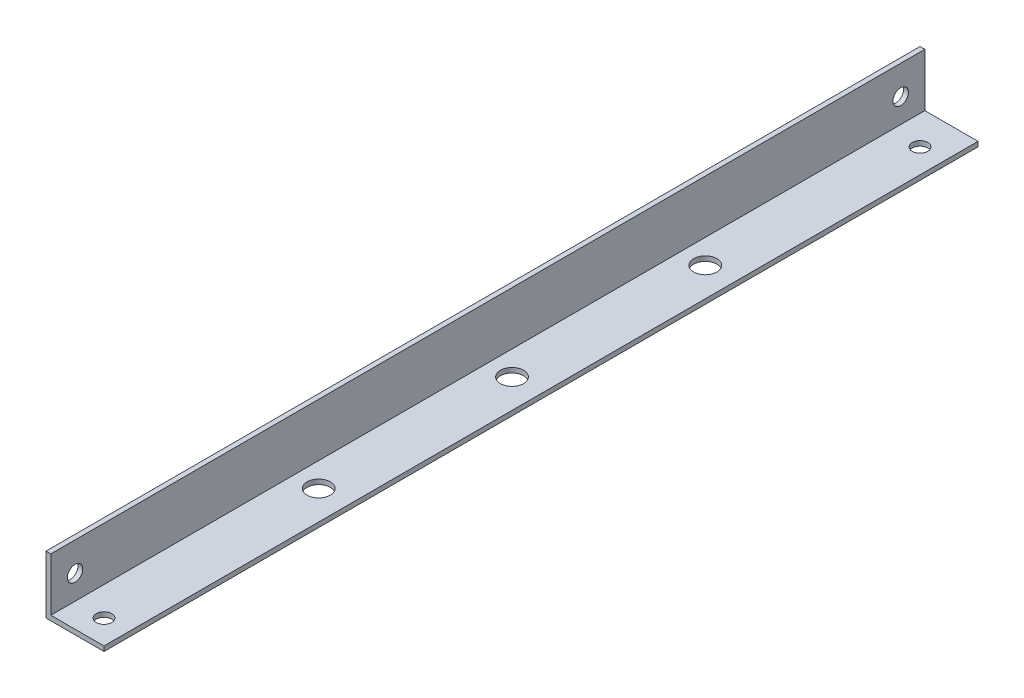
ISO-10303-21;
HEADER;
FILE_DESCRIPTION(('STEP AP214'),'2;1');
FILE_NAME('part.step','',(''),(''),'','','');
FILE_SCHEMA(('AUTOMOTIVE_DESIGN { 1 0 10303 214 1 1 1 1 }'));
ENDSEC;
DATA;
#1=APPLICATION_CONTEXT('core data for automotive mechanical design processes');
#2=APPLICATION_PROTOCOL_DEFINITION('international standard','automotive_design',2000,#1);
#3=PRODUCT_CONTEXT('',#1,'mechanical');
#4=PRODUCT('Part','Part','',(#3));
#5=PRODUCT_RELATED_PRODUCT_CATEGORY('part','',(#4));
#6=PRODUCT_DEFINITION_FORMATION('','',#4);
#7=PRODUCT_DEFINITION_CONTEXT('part definition',#1,'design');
#8=PRODUCT_DEFINITION('design','',#6,#7);
#9=PRODUCT_DEFINITION_SHAPE('','',#8);
#10=(LENGTH_UNIT() NAMED_UNIT(*) SI_UNIT(.MILLI.,.METRE.));
#11=(NAMED_UNIT(*) PLANE_ANGLE_UNIT() SI_UNIT($,.RADIAN.));
#12=(NAMED_UNIT(*) SI_UNIT($,.STERADIAN.) SOLID_ANGLE_UNIT());
#13=UNCERTAINTY_MEASURE_WITH_UNIT(LENGTH_MEASURE(1.E-05),#10,'distance_accuracy_value','');
#14=(GEOMETRIC_REPRESENTATION_CONTEXT(3) GLOBAL_UNCERTAINTY_ASSIGNED_CONTEXT((#13)) GLOBAL_UNIT_ASSIGNED_CONTEXT((#10,
#11,#12)) REPRESENTATION_CONTEXT('',''));
#15=CARTESIAN_POINT('',(0.,0.,0.));
#16=DIRECTION('',(0.,0.,1.));
#17=DIRECTION('',(1.,0.,0.));
#18=AXIS2_PLACEMENT_3D('',#15,#16,#17);
#19=CARTESIAN_POINT('',(30.,0.,226.1));
#20=DIRECTION('',(0.,1.,0.));
#21=DIRECTION('',(-1.,0.,0.));
#22=AXIS2_PLACEMENT_3D('',#19,#20,#21);
#23=PLANE('',#22);
#24=CARTESIAN_POINT('',(15.,0.,0.));
#25=DIRECTION('',(0.,1.,0.));
#26=DIRECTION('',(-1.,0.,0.));
#27=AXIS2_PLACEMENT_3D('',#24,#25,#26);
#28=CIRCLE('',#27,6.);
#29=CARTESIAN_POINT('',(9.,0.,0.));
#30=VERTEX_POINT('',#29);
#31=EDGE_CURVE('E165',#30,#30,#28,.T.);
#32=ORIENTED_EDGE('',*,*,#31,.T.);
#33=EDGE_LOOP('',(#32));
#34=FACE_BOUND('',#33,.T.);
#35=CARTESIAN_POINT('',(15.,0.,-100.));
#36=DIRECTION('',(0.,1.,0.));
#37=DIRECTION('',(1.,0.,0.));
#38=AXIS2_PLACEMENT_3D('',#35,#36,#37);
#39=CIRCLE('',#38,6.00000000000001);
#40=CARTESIAN_POINT('',(9.00000000000001,0.,-100.));
#41=VERTEX_POINT('',#40);
#42=EDGE_CURVE('E159',#41,#41,#39,.T.);
#43=ORIENTED_EDGE('',*,*,#42,.T.);
#44=EDGE_LOOP('',(#43));
#45=FACE_BOUND('',#44,.T.);
#46=CARTESIAN_POINT('',(15.,0.,100.));
#47=DIRECTION('',(0.,1.,0.));
#48=DIRECTION('',(-1.,0.,0.));
#49=AXIS2_PLACEMENT_3D('',#46,#47,#48);
#50=CIRCLE('',#49,6.00000000000001);
#51=CARTESIAN_POINT('',(9.00000000000001,0.,100.));
#52=VERTEX_POINT('',#51);
#53=EDGE_CURVE('E153',#52,#52,#50,.T.);
#54=ORIENTED_EDGE('',*,*,#53,.T.);
#55=EDGE_LOOP('',(#54));
#56=FACE_BOUND('',#55,.T.);
#57=CARTESIAN_POINT('',(17.5,0.,213.6));
#58=DIRECTION('',(0.,1.,0.));
#59=DIRECTION('',(1.,0.,0.));
#60=AXIS2_PLACEMENT_3D('',#57,#58,#59);
#61=CIRCLE('',#60,4.);
#62=CARTESIAN_POINT('',(13.5,0.,213.6));
#63=VERTEX_POINT('',#62);
#64=EDGE_CURVE('E147',#63,#63,#61,.T.);
#65=ORIENTED_EDGE('',*,*,#64,.T.);
#66=EDGE_LOOP('',(#65));
#67=FACE_BOUND('',#66,.T.);
#68=CARTESIAN_POINT('',(17.5,0.,-208.6));
#69=DIRECTION('',(0.,1.,0.));
#70=DIRECTION('',(-1.,0.,0.));
#71=AXIS2_PLACEMENT_3D('',#68,#69,#70);
#72=CIRCLE('',#71,4.);
#73=CARTESIAN_POINT('',(13.5,0.,-208.6));
#74=VERTEX_POINT('',#73);
#75=EDGE_CURVE('E121',#74,#74,#72,.T.);
#76=ORIENTED_EDGE('',*,*,#75,.T.);
#77=EDGE_LOOP('',(#76));
#78=FACE_BOUND('',#77,.T.);
#79=DIRECTION('',(1.,0.,0.));
#80=VECTOR('',#79,1.);
#81=CARTESIAN_POINT('',(30.,0.,-226.1));
#82=LINE('',#81,#80);
#83=CARTESIAN_POINT('',(0.,0.,-226.1));
#84=VERTEX_POINT('',#83);
#85=CARTESIAN_POINT('',(30.,0.,-226.1));
#86=VERTEX_POINT('',#85);
#87=EDGE_CURVE('E117',#84,#86,#82,.T.);
#88=ORIENTED_EDGE('',*,*,#87,.T.);
#89=DIRECTION('',(0.,0.,-1.));
#90=VECTOR('',#89,1.);
#91=CARTESIAN_POINT('',(30.,0.,226.1));
#92=LINE('',#91,#90);
#93=CARTESIAN_POINT('',(30.,0.,226.1));
#94=VERTEX_POINT('',#93);
#95=EDGE_CURVE('E11',#94,#86,#92,.T.);
#96=ORIENTED_EDGE('',*,*,#95,.F.);
#97=DIRECTION('',(1.,0.,0.));
#98=VECTOR('',#97,1.);
#99=CARTESIAN_POINT('',(30.,0.,226.1));
#100=LINE('',#99,#98);
#101=CARTESIAN_POINT('',(0.,0.,226.1));
#102=VERTEX_POINT('',#101);
#103=EDGE_CURVE('E129',#102,#94,#100,.T.);
#104=ORIENTED_EDGE('',*,*,#103,.F.);
#105=DIRECTION('',(0.,0.,-1.));
#106=VECTOR('',#105,1.);
#107=CARTESIAN_POINT('',(0.,0.,226.1));
#108=LINE('',#107,#106);
#109=EDGE_CURVE('E113',#102,#84,#108,.T.);
#110=ORIENTED_EDGE('',*,*,#109,.T.);
#111=EDGE_LOOP('',(#88,#96,#104,#110));
#112=FACE_BOUND('',#111,.T.);
#113=ADVANCED_FACE('F32',(#34,#45,#56,#67,#78,#112),#23,.F.);
#114=CARTESIAN_POINT('',(30.,2.5,226.1));
#115=DIRECTION('',(-1.,0.,0.));
#116=DIRECTION('',(0.,0.,1.));
#117=AXIS2_PLACEMENT_3D('',#114,#115,#116);
#118=PLANE('',#117);
#119=DIRECTION('',(0.,1.,0.));
#120=VECTOR('',#119,1.);
#121=CARTESIAN_POINT('',(30.,2.5,-226.1));
#122=LINE('',#121,#120);
#123=CARTESIAN_POINT('',(30.,2.5,-226.1));
#124=VERTEX_POINT('',#123);
#125=EDGE_CURVE('E120',#86,#124,#122,.T.);
#126=ORIENTED_EDGE('',*,*,#125,.T.);
#127=DIRECTION('',(0.,0.,-1.));
#128=VECTOR('',#127,1.);
#129=CARTESIAN_POINT('',(30.,2.5,226.1));
#130=LINE('',#129,#128);
#131=CARTESIAN_POINT('',(30.,2.5,226.1));
#132=VERTEX_POINT('',#131);
#133=EDGE_CURVE('E40',#132,#124,#130,.T.);
#134=ORIENTED_EDGE('',*,*,#133,.F.);
#135=DIRECTION('',(0.,1.,0.));
#136=VECTOR('',#135,1.);
#137=CARTESIAN_POINT('',(30.,2.5,226.1));
#138=LINE('',#137,#136);
#139=EDGE_CURVE('E83',#94,#132,#138,.T.);
#140=ORIENTED_EDGE('',*,*,#139,.F.);
#141=ORIENTED_EDGE('',*,*,#95,.T.);
#142=EDGE_LOOP('',(#126,#134,#140,#141));
#143=FACE_BOUND('',#142,.T.);
#144=ADVANCED_FACE('F212',(#143),#118,.F.);
#145=CARTESIAN_POINT('',(2.5,2.5,226.1));
#146=DIRECTION('',(0.,-1.,0.));
#147=DIRECTION('',(1.,0.,0.));
#148=AXIS2_PLACEMENT_3D('',#145,#146,#147);
#149=PLANE('',#148);
#150=CARTESIAN_POINT('',(15.,2.5,0.));
#151=DIRECTION('',(0.,1.,0.));
#152=DIRECTION('',(-1.,0.,0.));
#153=AXIS2_PLACEMENT_3D('',#150,#151,#152);
#154=CIRCLE('',#153,6.);
#155=CARTESIAN_POINT('',(9.,2.5,0.));
#156=VERTEX_POINT('',#155);
#157=EDGE_CURVE('E168',#156,#156,#154,.T.);
#158=ORIENTED_EDGE('',*,*,#157,.F.);
#159=EDGE_LOOP('',(#158));
#160=FACE_BOUND('',#159,.T.);
#161=CARTESIAN_POINT('',(15.,2.5,-100.));
#162=DIRECTION('',(0.,1.,0.));
#163=DIRECTION('',(1.,0.,0.));
#164=AXIS2_PLACEMENT_3D('',#161,#162,#163);
#165=CIRCLE('',#164,6.00000000000001);
#166=CARTESIAN_POINT('',(9.00000000000001,2.5,-100.));
#167=VERTEX_POINT('',#166);
#168=EDGE_CURVE('E162',#167,#167,#165,.T.);
#169=ORIENTED_EDGE('',*,*,#168,.F.);
#170=EDGE_LOOP('',(#169));
#171=FACE_BOUND('',#170,.T.);
#172=CARTESIAN_POINT('',(15.,2.5,100.));
#173=DIRECTION('',(0.,1.,0.));
#174=DIRECTION('',(-1.,0.,0.));
#175=AXIS2_PLACEMENT_3D('',#172,#173,#174);
#176=CIRCLE('',#175,6.00000000000001);
#177=CARTESIAN_POINT('',(9.00000000000001,2.5,100.));
#178=VERTEX_POINT('',#177);
#179=EDGE_CURVE('E156',#178,#178,#176,.T.);
#180=ORIENTED_EDGE('',*,*,#179,.F.);
#181=EDGE_LOOP('',(#180));
#182=FACE_BOUND('',#181,.T.);
#183=CARTESIAN_POINT('',(17.5,2.5,213.6));
#184=DIRECTION('',(0.,1.,0.));
#185=DIRECTION('',(1.,0.,0.));
#186=AXIS2_PLACEMENT_3D('',#183,#184,#185);
#187=CIRCLE('',#186,4.);
#188=CARTESIAN_POINT('',(13.5,2.5,213.6));
#189=VERTEX_POINT('',#188);
#190=EDGE_CURVE('E150',#189,#189,#187,.T.);
#191=ORIENTED_EDGE('',*,*,#190,.F.);
#192=EDGE_LOOP('',(#191));
#193=FACE_BOUND('',#192,.T.);
#194=CARTESIAN_POINT('',(17.5,2.5,-208.6));
#195=DIRECTION('',(0.,1.,0.));
#196=DIRECTION('',(-1.,0.,0.));
#197=AXIS2_PLACEMENT_3D('',#194,#195,#196);
#198=CIRCLE('',#197,4.);
#199=CARTESIAN_POINT('',(13.5,2.5,-208.6));
#200=VERTEX_POINT('',#199);
#201=EDGE_CURVE('E144',#200,#200,#198,.T.);
#202=ORIENTED_EDGE('',*,*,#201,.F.);
#203=EDGE_LOOP('',(#202));
#204=FACE_BOUND('',#203,.T.);
#205=DIRECTION('',(-1.,0.,0.));
#206=VECTOR('',#205,1.);
#207=CARTESIAN_POINT('',(2.5,2.5,-226.1));
#208=LINE('',#207,#206);
#209=CARTESIAN_POINT('',(2.5,2.5,-226.1));
#210=VERTEX_POINT('',#209);
#211=EDGE_CURVE('E123',#124,#210,#208,.T.);
#212=ORIENTED_EDGE('',*,*,#211,.T.);
#213=DIRECTION('',(0.,0.,-1.));
#214=VECTOR('',#213,1.);
#215=CARTESIAN_POINT('',(2.5,2.5,226.1));
#216=LINE('',#215,#214);
#217=CARTESIAN_POINT('',(2.5,2.5,226.1));
#218=VERTEX_POINT('',#217);
#219=EDGE_CURVE('E108',#218,#210,#216,.T.);
#220=ORIENTED_EDGE('',*,*,#219,.F.);
#221=DIRECTION('',(-1.,0.,0.));
#222=VECTOR('',#221,1.);
#223=CARTESIAN_POINT('',(2.5,2.5,226.1));
#224=LINE('',#223,#222);
#225=EDGE_CURVE('E97',#132,#218,#224,.T.);
#226=ORIENTED_EDGE('',*,*,#225,.F.);
#227=ORIENTED_EDGE('',*,*,#133,.T.);
#228=EDGE_LOOP('',(#212,#220,#226,#227));
#229=FACE_BOUND('',#228,.T.);
#230=ADVANCED_FACE('F135',(#160,#171,#182,#193,#204,#229),#149,.F.);
#231=CARTESIAN_POINT('',(2.5,30.,226.1));
#232=DIRECTION('',(-1.,0.,0.));
#233=DIRECTION('',(0.,0.,1.));
#234=AXIS2_PLACEMENT_3D('',#231,#232,#233);
#235=PLANE('',#234);
#236=CARTESIAN_POINT('',(2.5,15.,-213.6));
#237=DIRECTION('',(1.,0.,0.));
#238=DIRECTION('',(0.,0.,1.));
#239=AXIS2_PLACEMENT_3D('',#236,#237,#238);
#240=CIRCLE('',#239,3.99999999999999);
#241=CARTESIAN_POINT('',(2.5,15.,-209.6));
#242=VERTEX_POINT('',#241);
#243=EDGE_CURVE('E180',#242,#242,#240,.T.);
#244=ORIENTED_EDGE('',*,*,#243,.F.);
#245=EDGE_LOOP('',(#244));
#246=FACE_BOUND('',#245,.T.);
#247=CARTESIAN_POINT('',(2.5,15.,213.6));
#248=DIRECTION('',(1.,0.,0.));
#249=DIRECTION('',(0.,0.,-1.));
#250=AXIS2_PLACEMENT_3D('',#247,#248,#249);
#251=CIRCLE('',#250,3.99999999999999);
#252=CARTESIAN_POINT('',(2.5,15.,209.6));
#253=VERTEX_POINT('',#252);
#254=EDGE_CURVE('E174',#253,#253,#251,.T.);
#255=ORIENTED_EDGE('',*,*,#254,.F.);
#256=EDGE_LOOP('',(#255));
#257=FACE_BOUND('',#256,.T.);
#258=DIRECTION('',(0.,1.,0.));
#259=VECTOR('',#258,1.);
#260=CARTESIAN_POINT('',(2.5,30.,-226.1));
#261=LINE('',#260,#259);
#262=CARTESIAN_POINT('',(2.5,30.,-226.1));
#263=VERTEX_POINT('',#262);
#264=EDGE_CURVE('E106',#210,#263,#261,.T.);
#265=ORIENTED_EDGE('',*,*,#264,.T.);
#266=DIRECTION('',(0.,0.,-1.));
#267=VECTOR('',#266,1.);
#268=CARTESIAN_POINT('',(2.5,30.,226.1));
#269=LINE('',#268,#267);
#270=CARTESIAN_POINT('',(2.5,30.,226.1));
#271=VERTEX_POINT('',#270);
#272=EDGE_CURVE('E103',#271,#263,#269,.T.);
#273=ORIENTED_EDGE('',*,*,#272,.F.);
#274=DIRECTION('',(0.,1.,0.));
#275=VECTOR('',#274,1.);
#276=CARTESIAN_POINT('',(2.5,30.,226.1));
#277=LINE('',#276,#275);
#278=EDGE_CURVE('E90',#218,#271,#277,.T.);
#279=ORIENTED_EDGE('',*,*,#278,.F.);
#280=ORIENTED_EDGE('',*,*,#219,.T.);
#281=EDGE_LOOP('',(#265,#273,#279,#280));
#282=FACE_BOUND('',#281,.T.);
#283=ADVANCED_FACE('F104',(#246,#257,#282),#235,.F.);
#284=CARTESIAN_POINT('',(0.,30.,226.1));
#285=DIRECTION('',(0.,-1.,0.));
#286=DIRECTION('',(0.,0.,-1.));
#287=AXIS2_PLACEMENT_3D('',#284,#285,#286);
#288=PLANE('',#287);
#289=DIRECTION('',(-1.,0.,0.));
#290=VECTOR('',#289,1.);
#291=CARTESIAN_POINT('',(0.,30.,-226.1));
#292=LINE('',#291,#290);
#293=CARTESIAN_POINT('',(0.,30.,-226.1));
#294=VERTEX_POINT('',#293);
#295=EDGE_CURVE('E126',#263,#294,#292,.T.);
#296=ORIENTED_EDGE('',*,*,#295,.T.);
#297=DIRECTION('',(0.,0.,-1.));
#298=VECTOR('',#297,1.);
#299=CARTESIAN_POINT('',(0.,30.,226.1));
#300=LINE('',#299,#298);
#301=CARTESIAN_POINT('',(0.,30.,226.1));
#302=VERTEX_POINT('',#301);
#303=EDGE_CURVE('E109',#302,#294,#300,.T.);
#304=ORIENTED_EDGE('',*,*,#303,.F.);
#305=DIRECTION('',(-1.,0.,0.));
#306=VECTOR('',#305,1.);
#307=CARTESIAN_POINT('',(0.,30.,226.1));
#308=LINE('',#307,#306);
#309=EDGE_CURVE('E94',#271,#302,#308,.T.);
#310=ORIENTED_EDGE('',*,*,#309,.F.);
#311=ORIENTED_EDGE('',*,*,#272,.T.);
#312=EDGE_LOOP('',(#296,#304,#310,#311));
#313=FACE_BOUND('',#312,.T.);
#314=ADVANCED_FACE('F111',(#313),#288,.F.);
#315=CARTESIAN_POINT('',(0.,2.5,226.1));
#316=DIRECTION('',(1.,0.,0.));
#317=DIRECTION('',(0.,0.,-1.));
#318=AXIS2_PLACEMENT_3D('',#315,#316,#317);
#319=PLANE('',#318);
#320=CARTESIAN_POINT('',(0.,15.,-213.6));
#321=DIRECTION('',(1.,0.,0.));
#322=DIRECTION('',(0.,0.,1.));
#323=AXIS2_PLACEMENT_3D('',#320,#321,#322);
#324=CIRCLE('',#323,3.99999999999999);
#325=CARTESIAN_POINT('',(0.,15.,-209.6));
#326=VERTEX_POINT('',#325);
#327=EDGE_CURVE('E177',#326,#326,#324,.T.);
#328=ORIENTED_EDGE('',*,*,#327,.T.);
#329=EDGE_LOOP('',(#328));
#330=FACE_BOUND('',#329,.T.);
#331=CARTESIAN_POINT('',(0.,15.,213.6));
#332=DIRECTION('',(1.,0.,0.));
#333=DIRECTION('',(0.,0.,-1.));
#334=AXIS2_PLACEMENT_3D('',#331,#332,#333);
#335=CIRCLE('',#334,3.99999999999999);
#336=CARTESIAN_POINT('',(0.,15.,209.6));
#337=VERTEX_POINT('',#336);
#338=EDGE_CURVE('E171',#337,#337,#335,.T.);
#339=ORIENTED_EDGE('',*,*,#338,.T.);
#340=EDGE_LOOP('',(#339));
#341=FACE_BOUND('',#340,.T.);
#342=DIRECTION('',(0.,-1.,0.));
#343=VECTOR('',#342,1.);
#344=CARTESIAN_POINT('',(0.,2.5,-226.1));
#345=LINE('',#344,#343);
#346=EDGE_CURVE('E71',#294,#84,#345,.T.);
#347=ORIENTED_EDGE('',*,*,#346,.T.);
#348=ORIENTED_EDGE('',*,*,#109,.F.);
#349=DIRECTION('',(0.,-1.,0.));
#350=VECTOR('',#349,1.);
#351=CARTESIAN_POINT('',(0.,2.5,226.1));
#352=LINE('',#351,#350);
#353=EDGE_CURVE('E48',#302,#102,#352,.T.);
#354=ORIENTED_EDGE('',*,*,#353,.F.);
#355=ORIENTED_EDGE('',*,*,#303,.T.);
#356=EDGE_LOOP('',(#347,#348,#354,#355));
#357=FACE_BOUND('',#356,.T.);
#358=ADVANCED_FACE('F137',(#330,#341,#357),#319,.F.);
#359=CARTESIAN_POINT('',(0.,0.,226.1));
#360=DIRECTION('',(0.,0.,1.));
#361=DIRECTION('',(1.,0.,0.));
#362=AXIS2_PLACEMENT_3D('',#359,#360,#361);
#363=PLANE('',#362);
#364=ORIENTED_EDGE('',*,*,#103,.T.);
#365=ORIENTED_EDGE('',*,*,#139,.T.);
#366=ORIENTED_EDGE('',*,*,#225,.T.);
#367=ORIENTED_EDGE('',*,*,#278,.T.);
#368=ORIENTED_EDGE('',*,*,#309,.T.);
#369=ORIENTED_EDGE('',*,*,#353,.T.);
#370=EDGE_LOOP('',(#364,#365,#366,#367,#368,#369));
#371=FACE_BOUND('',#370,.T.);
#372=ADVANCED_FACE('F92',(#371),#363,.T.);
#373=CARTESIAN_POINT('',(0.,0.,-226.1));
#374=DIRECTION('',(0.,0.,1.));
#375=DIRECTION('',(1.,0.,0.));
#376=AXIS2_PLACEMENT_3D('',#373,#374,#375);
#377=PLANE('',#376);
#378=ORIENTED_EDGE('',*,*,#87,.F.);
#379=ORIENTED_EDGE('',*,*,#346,.F.);
#380=ORIENTED_EDGE('',*,*,#295,.F.);
#381=ORIENTED_EDGE('',*,*,#264,.F.);
#382=ORIENTED_EDGE('',*,*,#211,.F.);
#383=ORIENTED_EDGE('',*,*,#125,.F.);
#384=EDGE_LOOP('',(#378,#379,#380,#381,#382,#383));
#385=FACE_BOUND('',#384,.T.);
#386=ADVANCED_FACE('F136',(#385),#377,.F.);
#387=CARTESIAN_POINT('',(17.5,0.,-208.6));
#388=DIRECTION('',(0.,1.,0.));
#389=DIRECTION('',(-1.,0.,0.));
#390=AXIS2_PLACEMENT_3D('',#387,#388,#389);
#391=CYLINDRICAL_SURFACE('',#390,4.);
#392=CARTESIAN_POINT('',(13.5,0.,-208.6));
#393=CARTESIAN_POINT('',(13.5,0.0260416666666656,-208.6));
#394=CARTESIAN_POINT('',(13.5,0.0520833333333322,-208.6));
#395=CARTESIAN_POINT('',(13.5,0.104166666666666,-208.6));
#396=CARTESIAN_POINT('',(13.5,0.130208333333332,-208.6));
#397=CARTESIAN_POINT('',(13.5,0.182291666666666,-208.6));
#398=CARTESIAN_POINT('',(13.5,0.208333333333332,-208.6));
#399=CARTESIAN_POINT('',(13.5,0.260416666666666,-208.6));
#400=CARTESIAN_POINT('',(13.5,0.286458333333332,-208.6));
#401=CARTESIAN_POINT('',(13.5,0.338541666666666,-208.6));
#402=CARTESIAN_POINT('',(13.5,0.364583333333332,-208.6));
#403=CARTESIAN_POINT('',(13.5,0.416666666666666,-208.6));
#404=CARTESIAN_POINT('',(13.5,0.442708333333332,-208.6));
#405=CARTESIAN_POINT('',(13.5,0.494791666666666,-208.6));
#406=CARTESIAN_POINT('',(13.5,0.520833333333332,-208.6));
#407=CARTESIAN_POINT('',(13.5,0.572916666666666,-208.6));
#408=CARTESIAN_POINT('',(13.5,0.598958333333332,-208.6));
#409=CARTESIAN_POINT('',(13.5,0.651041666666666,-208.6));
#410=CARTESIAN_POINT('',(13.5,0.677083333333332,-208.6));
#411=CARTESIAN_POINT('',(13.5,0.729166666666666,-208.6));
#412=CARTESIAN_POINT('',(13.5,0.755208333333333,-208.6));
#413=CARTESIAN_POINT('',(13.5,0.807291666666666,-208.6));
#414=CARTESIAN_POINT('',(13.5,0.833333333333333,-208.6));
#415=CARTESIAN_POINT('',(13.5,0.885416666666666,-208.6));
#416=CARTESIAN_POINT('',(13.5,0.911458333333333,-208.6));
#417=CARTESIAN_POINT('',(13.5,0.963541666666666,-208.6));
#418=CARTESIAN_POINT('',(13.5,0.989583333333333,-208.6));
#419=CARTESIAN_POINT('',(13.5,1.04166666666667,-208.6));
#420=CARTESIAN_POINT('',(13.5,1.06770833333333,-208.6));
#421=CARTESIAN_POINT('',(13.5,1.11979166666667,-208.6));
#422=CARTESIAN_POINT('',(13.5,1.14583333333333,-208.6));
#423=CARTESIAN_POINT('',(13.5,1.19791666666667,-208.6));
#424=CARTESIAN_POINT('',(13.5,1.22395833333333,-208.6));
#425=CARTESIAN_POINT('',(13.5,1.27604166666667,-208.6));
#426=CARTESIAN_POINT('',(13.5,1.30208333333333,-208.6));
#427=CARTESIAN_POINT('',(13.5,1.35416666666667,-208.6));
#428=CARTESIAN_POINT('',(13.5,1.38020833333333,-208.6));
#429=CARTESIAN_POINT('',(13.5,1.43229166666667,-208.6));
#430=CARTESIAN_POINT('',(13.5,1.45833333333333,-208.6));
#431=CARTESIAN_POINT('',(13.5,1.51041666666667,-208.6));
#432=CARTESIAN_POINT('',(13.5,1.53645833333333,-208.6));
#433=CARTESIAN_POINT('',(13.5,1.58854166666667,-208.6));
#434=CARTESIAN_POINT('',(13.5,1.61458333333333,-208.6));
#435=CARTESIAN_POINT('',(13.5,1.66666666666667,-208.6));
#436=CARTESIAN_POINT('',(13.5,1.69270833333333,-208.6));
#437=CARTESIAN_POINT('',(13.5,1.74479166666667,-208.6));
#438=CARTESIAN_POINT('',(13.5,1.77083333333333,-208.6));
#439=CARTESIAN_POINT('',(13.5,1.82291666666667,-208.6));
#440=CARTESIAN_POINT('',(13.5,1.84895833333333,-208.6));
#441=CARTESIAN_POINT('',(13.5,1.90104166666667,-208.6));
#442=CARTESIAN_POINT('',(13.5,1.92708333333333,-208.6));
#443=CARTESIAN_POINT('',(13.5,1.97916666666667,-208.6));
#444=CARTESIAN_POINT('',(13.5,2.00520833333333,-208.6));
#445=CARTESIAN_POINT('',(13.5,2.05729166666667,-208.6));
#446=CARTESIAN_POINT('',(13.5,2.08333333333333,-208.6));
#447=CARTESIAN_POINT('',(13.5,2.13541666666667,-208.6));
#448=CARTESIAN_POINT('',(13.5,2.16145833333333,-208.6));
#449=CARTESIAN_POINT('',(13.5,2.21354166666667,-208.6));
#450=CARTESIAN_POINT('',(13.5,2.23958333333333,-208.6));
#451=CARTESIAN_POINT('',(13.5,2.29166666666667,-208.6));
#452=CARTESIAN_POINT('',(13.5,2.31770833333333,-208.6));
#453=CARTESIAN_POINT('',(13.5,2.36979166666667,-208.6));
#454=CARTESIAN_POINT('',(13.5,2.39583333333333,-208.6));
#455=CARTESIAN_POINT('',(13.5,2.44791666666667,-208.6));
#456=CARTESIAN_POINT('',(13.5,2.47395833333333,-208.6));
#457=CARTESIAN_POINT('',(13.5,2.5,-208.6));
#458=B_SPLINE_CURVE_WITH_KNOTS('',3,(#392,#393,#394,#395,#396,#397,#398,#399,#400,#401,#402,
#403,#404,#405,#406,#407,#408,#409,#410,#411,#412,#413,#414,#415,#416,#417,#418,#419,#420,#421,
#422,#423,#424,#425,#426,#427,#428,#429,#430,#431,#432,#433,#434,#435,#436,#437,#438,#439,#440,
#441,#442,#443,#444,#445,#446,#447,#448,#449,#450,#451,#452,#453,#454,#455,#456,#457),
.UNSPECIFIED.,.F.,.F.,(4,2,2,2,2,2,2,2,2,2,2,2,2,2,2,2,2,2,2,2,2,2,2,2,2,2,2,2,2,2,2,2,4),(0.,
0.078125,0.15625,0.234375,0.3125,0.390625,0.46875,0.546875,0.625,0.703125,0.78125,0.859375,
0.9375,1.015625,1.09375,1.171875,1.25,1.328125,1.40625,1.484375,1.5625,1.640625,1.71875,
1.796875,1.875,1.953125,2.03125,2.109375,2.1875,2.265625,2.34375,2.421875,2.5),.UNSPECIFIED.);
#459=EDGE_CURVE('BSEAM227',#74,#200,#458,.T.);
#460=ORIENTED_EDGE('',*,*,#75,.F.);
#461=ORIENTED_EDGE('',*,*,#201,.T.);
#462=ORIENTED_EDGE('',*,*,#459,.T.);
#463=ORIENTED_EDGE('',*,*,#459,.F.);
#464=EDGE_LOOP('',(#460,#462,#461,#463));
#465=FACE_BOUND('',#464,.T.);
#466=ADVANCED_FACE('F227',(#465),#391,.F.);
#467=CARTESIAN_POINT('',(17.5,0.,213.6));
#468=DIRECTION('',(0.,1.,0.));
#469=DIRECTION('',(-1.,0.,0.));
#470=AXIS2_PLACEMENT_3D('',#467,#468,#469);
#471=CYLINDRICAL_SURFACE('',#470,4.);
#472=CARTESIAN_POINT('',(13.5,0.,213.6));
#473=CARTESIAN_POINT('',(13.5,0.0260416666666656,213.6));
#474=CARTESIAN_POINT('',(13.5,0.0520833333333322,213.6));
#475=CARTESIAN_POINT('',(13.5,0.104166666666666,213.6));
#476=CARTESIAN_POINT('',(13.5,0.130208333333332,213.6));
#477=CARTESIAN_POINT('',(13.5,0.182291666666666,213.6));
#478=CARTESIAN_POINT('',(13.5,0.208333333333332,213.6));
#479=CARTESIAN_POINT('',(13.5,0.260416666666666,213.6));
#480=CARTESIAN_POINT('',(13.5,0.286458333333332,213.6));
#481=CARTESIAN_POINT('',(13.5,0.338541666666666,213.6));
#482=CARTESIAN_POINT('',(13.5,0.364583333333332,213.6));
#483=CARTESIAN_POINT('',(13.5,0.416666666666666,213.6));
#484=CARTESIAN_POINT('',(13.5,0.442708333333332,213.6));
#485=CARTESIAN_POINT('',(13.5,0.494791666666666,213.6));
#486=CARTESIAN_POINT('',(13.5,0.520833333333332,213.6));
#487=CARTESIAN_POINT('',(13.5,0.572916666666666,213.6));
#488=CARTESIAN_POINT('',(13.5,0.598958333333332,213.6));
#489=CARTESIAN_POINT('',(13.5,0.651041666666666,213.6));
#490=CARTESIAN_POINT('',(13.5,0.677083333333332,213.6));
#491=CARTESIAN_POINT('',(13.5,0.729166666666666,213.6));
#492=CARTESIAN_POINT('',(13.5,0.755208333333333,213.6));
#493=CARTESIAN_POINT('',(13.5,0.807291666666666,213.6));
#494=CARTESIAN_POINT('',(13.5,0.833333333333333,213.6));
#495=CARTESIAN_POINT('',(13.5,0.885416666666666,213.6));
#496=CARTESIAN_POINT('',(13.5,0.911458333333333,213.6));
#497=CARTESIAN_POINT('',(13.5,0.963541666666666,213.6));
#498=CARTESIAN_POINT('',(13.5,0.989583333333333,213.6));
#499=CARTESIAN_POINT('',(13.5,1.04166666666667,213.6));
#500=CARTESIAN_POINT('',(13.5,1.06770833333333,213.6));
#501=CARTESIAN_POINT('',(13.5,1.11979166666667,213.6));
#502=CARTESIAN_POINT('',(13.5,1.14583333333333,213.6));
#503=CARTESIAN_POINT('',(13.5,1.19791666666667,213.6));
#504=CARTESIAN_POINT('',(13.5,1.22395833333333,213.6));
#505=CARTESIAN_POINT('',(13.5,1.27604166666667,213.6));
#506=CARTESIAN_POINT('',(13.5,1.30208333333333,213.6));
#507=CARTESIAN_POINT('',(13.5,1.35416666666667,213.6));
#508=CARTESIAN_POINT('',(13.5,1.38020833333333,213.6));
#509=CARTESIAN_POINT('',(13.5,1.43229166666667,213.6));
#510=CARTESIAN_POINT('',(13.5,1.45833333333333,213.6));
#511=CARTESIAN_POINT('',(13.5,1.51041666666667,213.6));
#512=CARTESIAN_POINT('',(13.5,1.53645833333333,213.6));
#513=CARTESIAN_POINT('',(13.5,1.58854166666667,213.6));
#514=CARTESIAN_POINT('',(13.5,1.61458333333333,213.6));
#515=CARTESIAN_POINT('',(13.5,1.66666666666667,213.6));
#516=CARTESIAN_POINT('',(13.5,1.69270833333333,213.6));
#517=CARTESIAN_POINT('',(13.5,1.74479166666667,213.6));
#518=CARTESIAN_POINT('',(13.5,1.77083333333333,213.6));
#519=CARTESIAN_POINT('',(13.5,1.82291666666667,213.6));
#520=CARTESIAN_POINT('',(13.5,1.84895833333333,213.6));
#521=CARTESIAN_POINT('',(13.5,1.90104166666667,213.6));
#522=CARTESIAN_POINT('',(13.5,1.92708333333333,213.6));
#523=CARTESIAN_POINT('',(13.5,1.97916666666667,213.6));
#524=CARTESIAN_POINT('',(13.5,2.00520833333333,213.6));
#525=CARTESIAN_POINT('',(13.5,2.05729166666667,213.6));
#526=CARTESIAN_POINT('',(13.5,2.08333333333333,213.6));
#527=CARTESIAN_POINT('',(13.5,2.13541666666667,213.6));
#528=CARTESIAN_POINT('',(13.5,2.16145833333333,213.6));
#529=CARTESIAN_POINT('',(13.5,2.21354166666667,213.6));
#530=CARTESIAN_POINT('',(13.5,2.23958333333333,213.6));
#531=CARTESIAN_POINT('',(13.5,2.29166666666667,213.6));
#532=CARTESIAN_POINT('',(13.5,2.31770833333333,213.6));
#533=CARTESIAN_POINT('',(13.5,2.36979166666667,213.6));
#534=CARTESIAN_POINT('',(13.5,2.39583333333333,213.6));
#535=CARTESIAN_POINT('',(13.5,2.44791666666667,213.6));
#536=CARTESIAN_POINT('',(13.5,2.47395833333333,213.6));
#537=CARTESIAN_POINT('',(13.5,2.5,213.6));
#538=B_SPLINE_CURVE_WITH_KNOTS('',3,(#472,#473,#474,#475,#476,#477,#478,#479,#480,#481,#482,
#483,#484,#485,#486,#487,#488,#489,#490,#491,#492,#493,#494,#495,#496,#497,#498,#499,#500,#501,
#502,#503,#504,#505,#506,#507,#508,#509,#510,#511,#512,#513,#514,#515,#516,#517,#518,#519,#520,
#521,#522,#523,#524,#525,#526,#527,#528,#529,#530,#531,#532,#533,#534,#535,#536,#537),
.UNSPECIFIED.,.F.,.F.,(4,2,2,2,2,2,2,2,2,2,2,2,2,2,2,2,2,2,2,2,2,2,2,2,2,2,2,2,2,2,2,2,4),(0.,
0.078125,0.15625,0.234375,0.3125,0.390625,0.46875,0.546875,0.625,0.703125,0.78125,0.859375,
0.9375,1.015625,1.09375,1.171875,1.25,1.328125,1.40625,1.484375,1.5625,1.640625,1.71875,
1.796875,1.875,1.953125,2.03125,2.109375,2.1875,2.265625,2.34375,2.421875,2.5),.UNSPECIFIED.);
#539=EDGE_CURVE('BSEAM230',#63,#189,#538,.T.);
#540=ORIENTED_EDGE('',*,*,#64,.F.);
#541=ORIENTED_EDGE('',*,*,#190,.T.);
#542=ORIENTED_EDGE('',*,*,#539,.T.);
#543=ORIENTED_EDGE('',*,*,#539,.F.);
#544=EDGE_LOOP('',(#540,#542,#541,#543));
#545=FACE_BOUND('',#544,.T.);
#546=ADVANCED_FACE('F230',(#545),#471,.F.);
#547=CARTESIAN_POINT('',(15.,0.,100.));
#548=DIRECTION('',(0.,1.,0.));
#549=DIRECTION('',(-1.,0.,0.));
#550=AXIS2_PLACEMENT_3D('',#547,#548,#549);
#551=CYLINDRICAL_SURFACE('',#550,6.00000000000001);
#552=CARTESIAN_POINT('',(9.00000000000001,0.,100.));
#553=CARTESIAN_POINT('',(9.00000000000001,0.0260416666666657,100.));
#554=CARTESIAN_POINT('',(9.00000000000001,0.0520833333333323,100.));
#555=CARTESIAN_POINT('',(9.00000000000001,0.104166666666666,100.));
#556=CARTESIAN_POINT('',(9.00000000000001,0.130208333333332,100.));
#557=CARTESIAN_POINT('',(9.00000000000001,0.182291666666666,100.));
#558=CARTESIAN_POINT('',(9.00000000000001,0.208333333333332,100.));
#559=CARTESIAN_POINT('',(9.00000000000001,0.260416666666666,100.));
#560=CARTESIAN_POINT('',(9.00000000000001,0.286458333333332,100.));
#561=CARTESIAN_POINT('',(9.00000000000001,0.338541666666666,100.));
#562=CARTESIAN_POINT('',(9.00000000000001,0.364583333333332,100.));
#563=CARTESIAN_POINT('',(9.00000000000001,0.416666666666666,100.));
#564=CARTESIAN_POINT('',(9.00000000000001,0.442708333333332,100.));
#565=CARTESIAN_POINT('',(9.00000000000001,0.494791666666666,100.));
#566=CARTESIAN_POINT('',(9.00000000000001,0.520833333333332,100.));
#567=CARTESIAN_POINT('',(9.00000000000001,0.572916666666666,100.));
#568=CARTESIAN_POINT('',(9.00000000000001,0.598958333333332,100.));
#569=CARTESIAN_POINT('',(9.00000000000001,0.651041666666666,100.));
#570=CARTESIAN_POINT('',(9.00000000000001,0.677083333333333,100.));
#571=CARTESIAN_POINT('',(9.00000000000001,0.729166666666666,100.));
#572=CARTESIAN_POINT('',(9.00000000000001,0.755208333333333,100.));
#573=CARTESIAN_POINT('',(9.00000000000001,0.807291666666666,100.));
#574=CARTESIAN_POINT('',(9.00000000000001,0.833333333333333,100.));
#575=CARTESIAN_POINT('',(9.00000000000001,0.885416666666666,100.));
#576=CARTESIAN_POINT('',(9.00000000000001,0.911458333333333,100.));
#577=CARTESIAN_POINT('',(9.00000000000001,0.963541666666666,100.));
#578=CARTESIAN_POINT('',(9.00000000000001,0.989583333333333,100.));
#579=CARTESIAN_POINT('',(9.00000000000001,1.04166666666667,100.));
#580=CARTESIAN_POINT('',(9.00000000000001,1.06770833333333,100.));
#581=CARTESIAN_POINT('',(9.00000000000001,1.11979166666667,100.));
#582=CARTESIAN_POINT('',(9.00000000000001,1.14583333333333,100.));
#583=CARTESIAN_POINT('',(9.00000000000001,1.19791666666667,100.));
#584=CARTESIAN_POINT('',(9.00000000000001,1.22395833333333,100.));
#585=CARTESIAN_POINT('',(9.00000000000001,1.27604166666667,100.));
#586=CARTESIAN_POINT('',(9.00000000000001,1.30208333333333,100.));
#587=CARTESIAN_POINT('',(9.00000000000001,1.35416666666667,100.));
#588=CARTESIAN_POINT('',(9.00000000000001,1.38020833333333,100.));
#589=CARTESIAN_POINT('',(9.00000000000001,1.43229166666667,100.));
#590=CARTESIAN_POINT('',(9.00000000000001,1.45833333333333,100.));
#591=CARTESIAN_POINT('',(9.00000000000001,1.51041666666667,100.));
#592=CARTESIAN_POINT('',(9.00000000000001,1.53645833333333,100.));
#593=CARTESIAN_POINT('',(9.00000000000001,1.58854166666667,100.));
#594=CARTESIAN_POINT('',(9.00000000000001,1.61458333333333,100.));
#595=CARTESIAN_POINT('',(9.00000000000001,1.66666666666667,100.));
#596=CARTESIAN_POINT('',(9.00000000000001,1.69270833333333,100.));
#597=CARTESIAN_POINT('',(9.00000000000001,1.74479166666667,100.));
#598=CARTESIAN_POINT('',(9.00000000000001,1.77083333333333,100.));
#599=CARTESIAN_POINT('',(9.00000000000001,1.82291666666667,100.));
#600=CARTESIAN_POINT('',(9.00000000000001,1.84895833333333,100.));
#601=CARTESIAN_POINT('',(9.00000000000001,1.90104166666667,100.));
#602=CARTESIAN_POINT('',(9.00000000000001,1.92708333333333,100.));
#603=CARTESIAN_POINT('',(9.00000000000001,1.97916666666667,100.));
#604=CARTESIAN_POINT('',(9.00000000000001,2.00520833333333,100.));
#605=CARTESIAN_POINT('',(9.00000000000001,2.05729166666667,100.));
#606=CARTESIAN_POINT('',(9.00000000000001,2.08333333333333,100.));
#607=CARTESIAN_POINT('',(9.00000000000001,2.13541666666667,100.));
#608=CARTESIAN_POINT('',(9.00000000000001,2.16145833333333,100.));
#609=CARTESIAN_POINT('',(9.00000000000001,2.21354166666667,100.));
#610=CARTESIAN_POINT('',(9.00000000000001,2.23958333333333,100.));
#611=CARTESIAN_POINT('',(9.00000000000001,2.29166666666667,100.));
#612=CARTESIAN_POINT('',(9.00000000000001,2.31770833333333,100.));
#613=CARTESIAN_POINT('',(9.00000000000001,2.36979166666667,100.));
#614=CARTESIAN_POINT('',(9.00000000000001,2.39583333333333,100.));
#615=CARTESIAN_POINT('',(9.00000000000001,2.44791666666667,100.));
#616=CARTESIAN_POINT('',(9.00000000000001,2.47395833333333,100.));
#617=CARTESIAN_POINT('',(9.00000000000001,2.5,100.));
#618=B_SPLINE_CURVE_WITH_KNOTS('',3,(#552,#553,#554,#555,#556,#557,#558,#559,#560,#561,#562,
#563,#564,#565,#566,#567,#568,#569,#570,#571,#572,#573,#574,#575,#576,#577,#578,#579,#580,#581,
#582,#583,#584,#585,#586,#587,#588,#589,#590,#591,#592,#593,#594,#595,#596,#597,#598,#599,#600,
#601,#602,#603,#604,#605,#606,#607,#608,#609,#610,#611,#612,#613,#614,#615,#616,#617),
.UNSPECIFIED.,.F.,.F.,(4,2,2,2,2,2,2,2,2,2,2,2,2,2,2,2,2,2,2,2,2,2,2,2,2,2,2,2,2,2,2,2,4),(0.,
0.078125,0.15625,0.234375,0.3125,0.390625,0.46875,0.546875,0.625,0.703125,0.78125,0.859375,
0.9375,1.015625,1.09375,1.171875,1.25,1.328125,1.40625,1.484375,1.5625,1.640625,1.71875,
1.796875,1.875,1.953125,2.03125,2.109375,2.1875,2.265625,2.34375,2.421875,2.5),.UNSPECIFIED.);
#619=EDGE_CURVE('BSEAM252',#52,#178,#618,.T.);
#620=ORIENTED_EDGE('',*,*,#53,.F.);
#621=ORIENTED_EDGE('',*,*,#179,.T.);
#622=ORIENTED_EDGE('',*,*,#619,.T.);
#623=ORIENTED_EDGE('',*,*,#619,.F.);
#624=EDGE_LOOP('',(#620,#622,#621,#623));
#625=FACE_BOUND('',#624,.T.);
#626=ADVANCED_FACE('F252',(#625),#551,.F.);
#627=CARTESIAN_POINT('',(15.,0.,-100.));
#628=DIRECTION('',(0.,1.,0.));
#629=DIRECTION('',(-1.,0.,0.));
#630=AXIS2_PLACEMENT_3D('',#627,#628,#629);
#631=CYLINDRICAL_SURFACE('',#630,6.00000000000001);
#632=CARTESIAN_POINT('',(9.00000000000001,0.,-100.));
#633=CARTESIAN_POINT('',(9.00000000000001,0.0260416666666657,-100.));
#634=CARTESIAN_POINT('',(9.00000000000001,0.0520833333333323,-100.));
#635=CARTESIAN_POINT('',(9.00000000000001,0.104166666666666,-100.));
#636=CARTESIAN_POINT('',(9.00000000000001,0.130208333333332,-100.));
#637=CARTESIAN_POINT('',(9.00000000000001,0.182291666666666,-100.));
#638=CARTESIAN_POINT('',(9.00000000000001,0.208333333333332,-100.));
#639=CARTESIAN_POINT('',(9.00000000000001,0.260416666666666,-100.));
#640=CARTESIAN_POINT('',(9.00000000000001,0.286458333333332,-100.));
#641=CARTESIAN_POINT('',(9.00000000000001,0.338541666666666,-100.));
#642=CARTESIAN_POINT('',(9.00000000000001,0.364583333333332,-100.));
#643=CARTESIAN_POINT('',(9.00000000000001,0.416666666666666,-100.));
#644=CARTESIAN_POINT('',(9.00000000000001,0.442708333333332,-100.));
#645=CARTESIAN_POINT('',(9.00000000000001,0.494791666666666,-100.));
#646=CARTESIAN_POINT('',(9.00000000000001,0.520833333333332,-100.));
#647=CARTESIAN_POINT('',(9.00000000000001,0.572916666666666,-100.));
#648=CARTESIAN_POINT('',(9.00000000000001,0.598958333333332,-100.));
#649=CARTESIAN_POINT('',(9.00000000000001,0.651041666666666,-100.));
#650=CARTESIAN_POINT('',(9.00000000000001,0.677083333333333,-100.));
#651=CARTESIAN_POINT('',(9.00000000000001,0.729166666666666,-100.));
#652=CARTESIAN_POINT('',(9.00000000000001,0.755208333333333,-100.));
#653=CARTESIAN_POINT('',(9.00000000000001,0.807291666666666,-100.));
#654=CARTESIAN_POINT('',(9.00000000000001,0.833333333333333,-100.));
#655=CARTESIAN_POINT('',(9.00000000000001,0.885416666666666,-100.));
#656=CARTESIAN_POINT('',(9.00000000000001,0.911458333333333,-100.));
#657=CARTESIAN_POINT('',(9.00000000000001,0.963541666666666,-100.));
#658=CARTESIAN_POINT('',(9.00000000000001,0.989583333333333,-100.));
#659=CARTESIAN_POINT('',(9.00000000000001,1.04166666666667,-100.));
#660=CARTESIAN_POINT('',(9.00000000000001,1.06770833333333,-100.));
#661=CARTESIAN_POINT('',(9.00000000000001,1.11979166666667,-100.));
#662=CARTESIAN_POINT('',(9.00000000000001,1.14583333333333,-100.));
#663=CARTESIAN_POINT('',(9.00000000000001,1.19791666666667,-100.));
#664=CARTESIAN_POINT('',(9.00000000000001,1.22395833333333,-100.));
#665=CARTESIAN_POINT('',(9.00000000000001,1.27604166666667,-100.));
#666=CARTESIAN_POINT('',(9.00000000000001,1.30208333333333,-100.));
#667=CARTESIAN_POINT('',(9.00000000000001,1.35416666666667,-100.));
#668=CARTESIAN_POINT('',(9.00000000000001,1.38020833333333,-100.));
#669=CARTESIAN_POINT('',(9.00000000000001,1.43229166666667,-100.));
#670=CARTESIAN_POINT('',(9.00000000000001,1.45833333333333,-100.));
#671=CARTESIAN_POINT('',(9.00000000000001,1.51041666666667,-100.));
#672=CARTESIAN_POINT('',(9.00000000000001,1.53645833333333,-100.));
#673=CARTESIAN_POINT('',(9.00000000000001,1.58854166666667,-100.));
#674=CARTESIAN_POINT('',(9.00000000000001,1.61458333333333,-100.));
#675=CARTESIAN_POINT('',(9.00000000000001,1.66666666666667,-100.));
#676=CARTESIAN_POINT('',(9.00000000000001,1.69270833333333,-100.));
#677=CARTESIAN_POINT('',(9.00000000000001,1.74479166666667,-100.));
#678=CARTESIAN_POINT('',(9.00000000000001,1.77083333333333,-100.));
#679=CARTESIAN_POINT('',(9.00000000000001,1.82291666666667,-100.));
#680=CARTESIAN_POINT('',(9.00000000000001,1.84895833333333,-100.));
#681=CARTESIAN_POINT('',(9.00000000000001,1.90104166666667,-100.));
#682=CARTESIAN_POINT('',(9.00000000000001,1.92708333333333,-100.));
#683=CARTESIAN_POINT('',(9.00000000000001,1.97916666666667,-100.));
#684=CARTESIAN_POINT('',(9.00000000000001,2.00520833333333,-100.));
#685=CARTESIAN_POINT('',(9.00000000000001,2.05729166666667,-100.));
#686=CARTESIAN_POINT('',(9.00000000000001,2.08333333333333,-100.));
#687=CARTESIAN_POINT('',(9.00000000000001,2.13541666666667,-100.));
#688=CARTESIAN_POINT('',(9.00000000000001,2.16145833333333,-100.));
#689=CARTESIAN_POINT('',(9.00000000000001,2.21354166666667,-100.));
#690=CARTESIAN_POINT('',(9.00000000000001,2.23958333333333,-100.));
#691=CARTESIAN_POINT('',(9.00000000000001,2.29166666666667,-100.));
#692=CARTESIAN_POINT('',(9.00000000000001,2.31770833333333,-100.));
#693=CARTESIAN_POINT('',(9.00000000000001,2.36979166666667,-100.));
#694=CARTESIAN_POINT('',(9.00000000000001,2.39583333333333,-100.));
#695=CARTESIAN_POINT('',(9.00000000000001,2.44791666666667,-100.));
#696=CARTESIAN_POINT('',(9.00000000000001,2.47395833333333,-100.));
#697=CARTESIAN_POINT('',(9.00000000000001,2.5,-100.));
#698=B_SPLINE_CURVE_WITH_KNOTS('',3,(#632,#633,#634,#635,#636,#637,#638,#639,#640,#641,#642,
#643,#644,#645,#646,#647,#648,#649,#650,#651,#652,#653,#654,#655,#656,#657,#658,#659,#660,#661,
#662,#663,#664,#665,#666,#667,#668,#669,#670,#671,#672,#673,#674,#675,#676,#677,#678,#679,#680,
#681,#682,#683,#684,#685,#686,#687,#688,#689,#690,#691,#692,#693,#694,#695,#696,#697),
.UNSPECIFIED.,.F.,.F.,(4,2,2,2,2,2,2,2,2,2,2,2,2,2,2,2,2,2,2,2,2,2,2,2,2,2,2,2,2,2,2,2,4),(0.,
0.078125,0.15625,0.234375,0.3125,0.390625,0.46875,0.546875,0.625,0.703125,0.78125,0.859375,
0.9375,1.015625,1.09375,1.171875,1.25,1.328125,1.40625,1.484375,1.5625,1.640625,1.71875,
1.796875,1.875,1.953125,2.03125,2.109375,2.1875,2.265625,2.34375,2.421875,2.5),.UNSPECIFIED.);
#699=EDGE_CURVE('BSEAM207',#41,#167,#698,.T.);
#700=ORIENTED_EDGE('',*,*,#42,.F.);
#701=ORIENTED_EDGE('',*,*,#168,.T.);
#702=ORIENTED_EDGE('',*,*,#699,.T.);
#703=ORIENTED_EDGE('',*,*,#699,.F.);
#704=EDGE_LOOP('',(#700,#702,#701,#703));
#705=FACE_BOUND('',#704,.T.);
#706=ADVANCED_FACE('F207',(#705),#631,.F.);
#707=CARTESIAN_POINT('',(15.,0.,0.));
#708=DIRECTION('',(0.,1.,0.));
#709=DIRECTION('',(-1.,0.,0.));
#710=AXIS2_PLACEMENT_3D('',#707,#708,#709);
#711=CYLINDRICAL_SURFACE('',#710,6.);
#712=CARTESIAN_POINT('',(9.,0.,0.));
#713=CARTESIAN_POINT('',(9.,0.0260416666666657,0.));
#714=CARTESIAN_POINT('',(9.,0.0520833333333323,0.));
#715=CARTESIAN_POINT('',(9.,0.104166666666666,0.));
#716=CARTESIAN_POINT('',(9.,0.130208333333332,0.));
#717=CARTESIAN_POINT('',(9.,0.182291666666666,0.));
#718=CARTESIAN_POINT('',(9.,0.208333333333332,0.));
#719=CARTESIAN_POINT('',(9.,0.260416666666666,0.));
#720=CARTESIAN_POINT('',(9.,0.286458333333332,0.));
#721=CARTESIAN_POINT('',(9.,0.338541666666666,0.));
#722=CARTESIAN_POINT('',(9.,0.364583333333332,0.));
#723=CARTESIAN_POINT('',(9.,0.416666666666666,0.));
#724=CARTESIAN_POINT('',(9.,0.442708333333332,0.));
#725=CARTESIAN_POINT('',(9.,0.494791666666666,0.));
#726=CARTESIAN_POINT('',(9.,0.520833333333332,0.));
#727=CARTESIAN_POINT('',(9.,0.572916666666666,0.));
#728=CARTESIAN_POINT('',(9.,0.598958333333332,0.));
#729=CARTESIAN_POINT('',(9.,0.651041666666666,0.));
#730=CARTESIAN_POINT('',(9.,0.677083333333333,0.));
#731=CARTESIAN_POINT('',(9.,0.729166666666666,0.));
#732=CARTESIAN_POINT('',(9.,0.755208333333333,0.));
#733=CARTESIAN_POINT('',(9.,0.807291666666666,0.));
#734=CARTESIAN_POINT('',(9.,0.833333333333333,0.));
#735=CARTESIAN_POINT('',(9.,0.885416666666666,0.));
#736=CARTESIAN_POINT('',(9.,0.911458333333333,0.));
#737=CARTESIAN_POINT('',(9.,0.963541666666666,0.));
#738=CARTESIAN_POINT('',(9.,0.989583333333333,0.));
#739=CARTESIAN_POINT('',(9.,1.04166666666667,0.));
#740=CARTESIAN_POINT('',(9.,1.06770833333333,0.));
#741=CARTESIAN_POINT('',(9.,1.11979166666667,0.));
#742=CARTESIAN_POINT('',(9.,1.14583333333333,0.));
#743=CARTESIAN_POINT('',(9.,1.19791666666667,0.));
#744=CARTESIAN_POINT('',(9.,1.22395833333333,0.));
#745=CARTESIAN_POINT('',(9.,1.27604166666667,0.));
#746=CARTESIAN_POINT('',(9.,1.30208333333333,0.));
#747=CARTESIAN_POINT('',(9.,1.35416666666667,0.));
#748=CARTESIAN_POINT('',(9.,1.38020833333333,0.));
#749=CARTESIAN_POINT('',(9.,1.43229166666667,0.));
#750=CARTESIAN_POINT('',(9.,1.45833333333333,0.));
#751=CARTESIAN_POINT('',(9.,1.51041666666667,0.));
#752=CARTESIAN_POINT('',(9.,1.53645833333333,0.));
#753=CARTESIAN_POINT('',(9.,1.58854166666667,0.));
#754=CARTESIAN_POINT('',(9.,1.61458333333333,0.));
#755=CARTESIAN_POINT('',(9.,1.66666666666667,0.));
#756=CARTESIAN_POINT('',(9.,1.69270833333333,0.));
#757=CARTESIAN_POINT('',(9.,1.74479166666667,0.));
#758=CARTESIAN_POINT('',(9.,1.77083333333333,0.));
#759=CARTESIAN_POINT('',(9.,1.82291666666667,0.));
#760=CARTESIAN_POINT('',(9.,1.84895833333333,0.));
#761=CARTESIAN_POINT('',(9.,1.90104166666667,0.));
#762=CARTESIAN_POINT('',(9.,1.92708333333333,0.));
#763=CARTESIAN_POINT('',(9.,1.97916666666667,0.));
#764=CARTESIAN_POINT('',(9.,2.00520833333333,0.));
#765=CARTESIAN_POINT('',(9.,2.05729166666667,0.));
#766=CARTESIAN_POINT('',(9.,2.08333333333333,0.));
#767=CARTESIAN_POINT('',(9.,2.13541666666667,0.));
#768=CARTESIAN_POINT('',(9.,2.16145833333333,0.));
#769=CARTESIAN_POINT('',(9.,2.21354166666667,0.));
#770=CARTESIAN_POINT('',(9.,2.23958333333333,0.));
#771=CARTESIAN_POINT('',(9.,2.29166666666667,0.));
#772=CARTESIAN_POINT('',(9.,2.31770833333333,0.));
#773=CARTESIAN_POINT('',(9.,2.36979166666667,0.));
#774=CARTESIAN_POINT('',(9.,2.39583333333333,0.));
#775=CARTESIAN_POINT('',(9.,2.44791666666667,0.));
#776=CARTESIAN_POINT('',(9.,2.47395833333333,0.));
#777=CARTESIAN_POINT('',(9.,2.5,0.));
#778=B_SPLINE_CURVE_WITH_KNOTS('',3,(#712,#713,#714,#715,#716,#717,#718,#719,#720,#721,#722,
#723,#724,#725,#726,#727,#728,#729,#730,#731,#732,#733,#734,#735,#736,#737,#738,#739,#740,#741,
#742,#743,#744,#745,#746,#747,#748,#749,#750,#751,#752,#753,#754,#755,#756,#757,#758,#759,#760,
#761,#762,#763,#764,#765,#766,#767,#768,#769,#770,#771,#772,#773,#774,#775,#776,#777),
.UNSPECIFIED.,.F.,.F.,(4,2,2,2,2,2,2,2,2,2,2,2,2,2,2,2,2,2,2,2,2,2,2,2,2,2,2,2,2,2,2,2,4),(0.,
0.078125,0.15625,0.234375,0.3125,0.390625,0.46875,0.546875,0.625,0.703125,0.78125,0.859375,
0.9375,1.015625,1.09375,1.171875,1.25,1.328125,1.40625,1.484375,1.5625,1.640625,1.71875,
1.796875,1.875,1.953125,2.03125,2.109375,2.1875,2.265625,2.34375,2.421875,2.5),.UNSPECIFIED.);
#779=EDGE_CURVE('BSEAM201',#30,#156,#778,.T.);
#780=ORIENTED_EDGE('',*,*,#31,.F.);
#781=ORIENTED_EDGE('',*,*,#157,.T.);
#782=ORIENTED_EDGE('',*,*,#779,.T.);
#783=ORIENTED_EDGE('',*,*,#779,.F.);
#784=EDGE_LOOP('',(#780,#782,#781,#783));
#785=FACE_BOUND('',#784,.T.);
#786=ADVANCED_FACE('F201',(#785),#711,.F.);
#787=CARTESIAN_POINT('',(0.,15.,213.6));
#788=DIRECTION('',(1.,0.,0.));
#789=DIRECTION('',(0.,0.,-1.));
#790=AXIS2_PLACEMENT_3D('',#787,#788,#789);
#791=CYLINDRICAL_SURFACE('',#790,3.99999999999999);
#792=ORIENTED_EDGE('',*,*,#338,.F.);
#793=EDGE_LOOP('',(#792));
#794=FACE_BOUND('',#793,.T.);
#795=ORIENTED_EDGE('',*,*,#254,.T.);
#796=EDGE_LOOP('',(#795));
#797=FACE_BOUND('',#796,.T.);
#798=ADVANCED_FACE('F191',(#794,#797),#791,.F.);
#799=CARTESIAN_POINT('',(0.,15.,-213.6));
#800=DIRECTION('',(1.,0.,0.));
#801=DIRECTION('',(0.,0.,-1.));
#802=AXIS2_PLACEMENT_3D('',#799,#800,#801);
#803=CYLINDRICAL_SURFACE('',#802,3.99999999999999);
#804=ORIENTED_EDGE('',*,*,#327,.F.);
#805=EDGE_LOOP('',(#804));
#806=FACE_BOUND('',#805,.T.);
#807=ORIENTED_EDGE('',*,*,#243,.T.);
#808=EDGE_LOOP('',(#807));
#809=FACE_BOUND('',#808,.T.);
#810=ADVANCED_FACE('F188',(#806,#809),#803,.F.);
#811=CLOSED_SHELL('',(#113,#144,#230,#283,#314,#358,#372,#386,#466,#546,#626,#706,#786,#798,#810));
#812=MANIFOLD_SOLID_BREP('B2',#811);
#813=ADVANCED_BREP_SHAPE_REPRESENTATION('',(#18,#812),#14);
#814=SHAPE_DEFINITION_REPRESENTATION(#9,#813);
ENDSEC;
END-ISO-10303-21;
